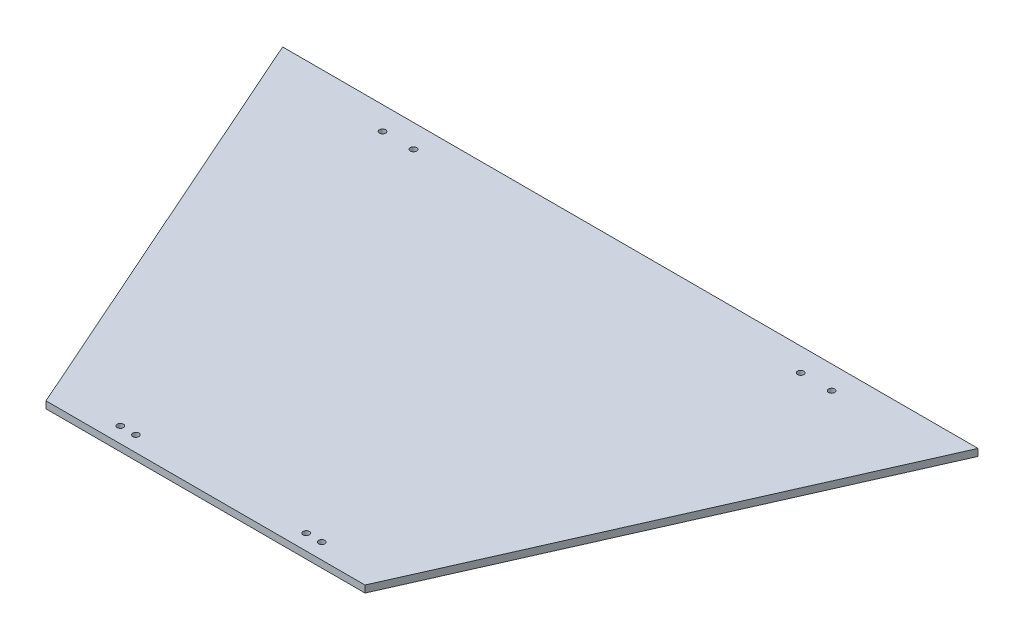
ISO-10303-21;
HEADER;
FILE_DESCRIPTION(('STEP AP214'),'2;1');
FILE_NAME('part.step','',(''),(''),'','','');
FILE_SCHEMA(('AUTOMOTIVE_DESIGN { 1 0 10303 214 1 1 1 1 }'));
ENDSEC;
DATA;
#1=APPLICATION_CONTEXT('core data for automotive mechanical design processes');
#2=APPLICATION_PROTOCOL_DEFINITION('international standard','automotive_design',2000,#1);
#3=PRODUCT_CONTEXT('',#1,'mechanical');
#4=PRODUCT('Part','Part','',(#3));
#5=PRODUCT_RELATED_PRODUCT_CATEGORY('part','',(#4));
#6=PRODUCT_DEFINITION_FORMATION('','',#4);
#7=PRODUCT_DEFINITION_CONTEXT('part definition',#1,'design');
#8=PRODUCT_DEFINITION('design','',#6,#7);
#9=PRODUCT_DEFINITION_SHAPE('','',#8);
#10=(LENGTH_UNIT() NAMED_UNIT(*) SI_UNIT(.MILLI.,.METRE.));
#11=(NAMED_UNIT(*) PLANE_ANGLE_UNIT() SI_UNIT($,.RADIAN.));
#12=(NAMED_UNIT(*) SI_UNIT($,.STERADIAN.) SOLID_ANGLE_UNIT());
#13=UNCERTAINTY_MEASURE_WITH_UNIT(LENGTH_MEASURE(1.E-05),#10,'distance_accuracy_value','');
#14=(GEOMETRIC_REPRESENTATION_CONTEXT(3) GLOBAL_UNCERTAINTY_ASSIGNED_CONTEXT((#13)) GLOBAL_UNIT_ASSIGNED_CONTEXT((#10,
#11,#12)) REPRESENTATION_CONTEXT('',''));
#15=CARTESIAN_POINT('',(0.,0.,0.));
#16=DIRECTION('',(0.,0.,1.));
#17=DIRECTION('',(1.,0.,0.));
#18=AXIS2_PLACEMENT_3D('',#15,#16,#17);
#19=CARTESIAN_POINT('',(-224.5,4.5,-274.3));
#20=DIRECTION('',(0.914319415465939,0.,-0.404993835140764));
#21=DIRECTION('',(-0.404993835140764,0.,-0.914319415465939));
#22=AXIS2_PLACEMENT_3D('',#19,#20,#21);
#23=PLANE('',#22);
#24=DIRECTION('',(0.404993835140764,0.,0.914319415465939));
#25=VECTOR('',#24,1.);
#26=CARTESIAN_POINT('',(-224.5,0.,-274.3));
#27=LINE('',#26,#25);
#28=CARTESIAN_POINT('',(-224.5,0.,-274.3));
#29=VERTEX_POINT('',#28);
#30=CARTESIAN_POINT('',(-103.,0.,0.));
#31=VERTEX_POINT('',#30);
#32=EDGE_CURVE('E101',#29,#31,#27,.T.);
#33=ORIENTED_EDGE('',*,*,#32,.T.);
#34=DIRECTION('',(0.,-1.,0.));
#35=VECTOR('',#34,1.);
#36=CARTESIAN_POINT('',(-103.,4.5,0.));
#37=LINE('',#36,#35);
#38=CARTESIAN_POINT('',(-103.,4.5,0.));
#39=VERTEX_POINT('',#38);
#40=EDGE_CURVE('E11',#39,#31,#37,.T.);
#41=ORIENTED_EDGE('',*,*,#40,.F.);
#42=DIRECTION('',(0.404993835140764,0.,0.914319415465939));
#43=VECTOR('',#42,1.);
#44=CARTESIAN_POINT('',(-224.5,4.5,-274.3));
#45=LINE('',#44,#43);
#46=CARTESIAN_POINT('',(-224.5,4.5,-274.3));
#47=VERTEX_POINT('',#46);
#48=EDGE_CURVE('E88',#47,#39,#45,.T.);
#49=ORIENTED_EDGE('',*,*,#48,.F.);
#50=DIRECTION('',(0.,-1.,0.));
#51=VECTOR('',#50,1.);
#52=CARTESIAN_POINT('',(-224.5,4.5,-274.3));
#53=LINE('',#52,#51);
#54=EDGE_CURVE('E97',#47,#29,#53,.T.);
#55=ORIENTED_EDGE('',*,*,#54,.T.);
#56=EDGE_LOOP('',(#33,#41,#49,#55));
#57=FACE_BOUND('',#56,.T.);
#58=ADVANCED_FACE('F35',(#57),#23,.F.);
#59=CARTESIAN_POINT('',(103.,4.5,0.));
#60=DIRECTION('',(0.,0.,-1.));
#61=DIRECTION('',(-1.,0.,0.));
#62=AXIS2_PLACEMENT_3D('',#59,#60,#61);
#63=PLANE('',#62);
#64=DIRECTION('',(1.,0.,0.));
#65=VECTOR('',#64,1.);
#66=CARTESIAN_POINT('',(103.,0.,0.));
#67=LINE('',#66,#65);
#68=CARTESIAN_POINT('',(103.,0.,0.));
#69=VERTEX_POINT('',#68);
#70=EDGE_CURVE('E92',#31,#69,#67,.T.);
#71=ORIENTED_EDGE('',*,*,#70,.T.);
#72=DIRECTION('',(0.,-1.,0.));
#73=VECTOR('',#72,1.);
#74=CARTESIAN_POINT('',(103.,4.5,0.));
#75=LINE('',#74,#73);
#76=CARTESIAN_POINT('',(103.,4.5,0.));
#77=VERTEX_POINT('',#76);
#78=EDGE_CURVE('E44',#77,#69,#75,.T.);
#79=ORIENTED_EDGE('',*,*,#78,.F.);
#80=DIRECTION('',(1.,0.,0.));
#81=VECTOR('',#80,1.);
#82=CARTESIAN_POINT('',(103.,4.5,0.));
#83=LINE('',#82,#81);
#84=EDGE_CURVE('E83',#39,#77,#83,.T.);
#85=ORIENTED_EDGE('',*,*,#84,.F.);
#86=ORIENTED_EDGE('',*,*,#40,.T.);
#87=EDGE_LOOP('',(#71,#79,#85,#86));
#88=FACE_BOUND('',#87,.T.);
#89=ADVANCED_FACE('F91',(#88),#63,.F.);
#90=CARTESIAN_POINT('',(224.5,4.5,-274.3));
#91=DIRECTION('',(-0.914319415465939,0.,-0.404993835140764));
#92=DIRECTION('',(-0.404993835140764,0.,0.914319415465939));
#93=AXIS2_PLACEMENT_3D('',#90,#91,#92);
#94=PLANE('',#93);
#95=DIRECTION('',(0.404993835140764,0.,-0.914319415465939));
#96=VECTOR('',#95,1.);
#97=CARTESIAN_POINT('',(224.5,0.,-274.3));
#98=LINE('',#97,#96);
#99=CARTESIAN_POINT('',(224.5,0.,-274.3));
#100=VERTEX_POINT('',#99);
#101=EDGE_CURVE('E70',#69,#100,#98,.T.);
#102=ORIENTED_EDGE('',*,*,#101,.T.);
#103=DIRECTION('',(0.,-1.,0.));
#104=VECTOR('',#103,1.);
#105=CARTESIAN_POINT('',(224.5,4.5,-274.3));
#106=LINE('',#105,#104);
#107=CARTESIAN_POINT('',(224.5,4.5,-274.3));
#108=VERTEX_POINT('',#107);
#109=EDGE_CURVE('E93',#108,#100,#106,.T.);
#110=ORIENTED_EDGE('',*,*,#109,.F.);
#111=DIRECTION('',(0.404993835140764,0.,-0.914319415465939));
#112=VECTOR('',#111,1.);
#113=CARTESIAN_POINT('',(224.5,4.5,-274.3));
#114=LINE('',#113,#112);
#115=EDGE_CURVE('E86',#77,#108,#114,.T.);
#116=ORIENTED_EDGE('',*,*,#115,.F.);
#117=ORIENTED_EDGE('',*,*,#78,.T.);
#118=EDGE_LOOP('',(#102,#110,#116,#117));
#119=FACE_BOUND('',#118,.T.);
#120=ADVANCED_FACE('F95',(#119),#94,.F.);
#121=CARTESIAN_POINT('',(-224.5,4.5,-274.3));
#122=DIRECTION('',(0.,0.,1.));
#123=DIRECTION('',(1.,0.,0.));
#124=AXIS2_PLACEMENT_3D('',#121,#122,#123);
#125=PLANE('',#124);
#126=DIRECTION('',(-1.,0.,0.));
#127=VECTOR('',#126,1.);
#128=CARTESIAN_POINT('',(-224.5,0.,-274.3));
#129=LINE('',#128,#127);
#130=EDGE_CURVE('E76',#100,#29,#129,.T.);
#131=ORIENTED_EDGE('',*,*,#130,.T.);
#132=ORIENTED_EDGE('',*,*,#54,.F.);
#133=DIRECTION('',(-1.,0.,0.));
#134=VECTOR('',#133,1.);
#135=CARTESIAN_POINT('',(-224.5,4.5,-274.3));
#136=LINE('',#135,#134);
#137=EDGE_CURVE('E53',#108,#47,#136,.T.);
#138=ORIENTED_EDGE('',*,*,#137,.F.);
#139=ORIENTED_EDGE('',*,*,#109,.T.);
#140=EDGE_LOOP('',(#131,#132,#138,#139));
#141=FACE_BOUND('',#140,.T.);
#142=ADVANCED_FACE('F157',(#141),#125,.F.);
#143=CARTESIAN_POINT('',(0.,4.5,0.));
#144=DIRECTION('',(0.,-1.,0.));
#145=DIRECTION('',(0.,0.,-1.));
#146=AXIS2_PLACEMENT_3D('',#143,#144,#145);
#147=PLANE('',#146);
#148=CARTESIAN_POINT('',(-145.,4.5,-259.3));
#149=DIRECTION('',(0.,1.,0.));
#150=DIRECTION('',(0.,0.,1.));
#151=AXIS2_PLACEMENT_3D('',#148,#149,#150);
#152=CIRCLE('',#151,2.);
#153=CARTESIAN_POINT('',(-145.,4.5,-257.3));
#154=VERTEX_POINT('',#153);
#155=EDGE_CURVE('E113',#154,#154,#152,.T.);
#156=ORIENTED_EDGE('',*,*,#155,.F.);
#157=EDGE_LOOP('',(#156));
#158=FACE_BOUND('',#157,.T.);
#159=CARTESIAN_POINT('',(65.,4.5,-10.));
#160=DIRECTION('',(0.,1.,0.));
#161=DIRECTION('',(0.,0.,-1.));
#162=AXIS2_PLACEMENT_3D('',#159,#160,#161);
#163=CIRCLE('',#162,2.);
#164=CARTESIAN_POINT('',(65.,4.5,-12.));
#165=VERTEX_POINT('',#164);
#166=EDGE_CURVE('E276',#165,#165,#163,.T.);
#167=ORIENTED_EDGE('',*,*,#166,.F.);
#168=EDGE_LOOP('',(#167));
#169=FACE_BOUND('',#168,.T.);
#170=CARTESIAN_POINT('',(55.,4.5,-10.));
#171=DIRECTION('',(0.,1.,0.));
#172=DIRECTION('',(0.,0.,-1.));
#173=AXIS2_PLACEMENT_3D('',#170,#171,#172);
#174=CIRCLE('',#173,2.);
#175=CARTESIAN_POINT('',(55.,4.5,-12.));
#176=VERTEX_POINT('',#175);
#177=EDGE_CURVE('E278',#176,#176,#174,.T.);
#178=ORIENTED_EDGE('',*,*,#177,.F.);
#179=EDGE_LOOP('',(#178));
#180=FACE_BOUND('',#179,.T.);
#181=CARTESIAN_POINT('',(-55.,4.5,-10.));
#182=DIRECTION('',(0.,1.,0.));
#183=DIRECTION('',(0.,0.,1.));
#184=AXIS2_PLACEMENT_3D('',#181,#182,#183);
#185=CIRCLE('',#184,2.);
#186=CARTESIAN_POINT('',(-55.,4.5,-8.00000000000002));
#187=VERTEX_POINT('',#186);
#188=EDGE_CURVE('E281',#187,#187,#185,.T.);
#189=ORIENTED_EDGE('',*,*,#188,.F.);
#190=EDGE_LOOP('',(#189));
#191=FACE_BOUND('',#190,.T.);
#192=CARTESIAN_POINT('',(-125.,4.5,-259.3));
#193=DIRECTION('',(0.,1.,0.));
#194=DIRECTION('',(0.,0.,1.));
#195=AXIS2_PLACEMENT_3D('',#192,#193,#194);
#196=CIRCLE('',#195,2.);
#197=CARTESIAN_POINT('',(-125.,4.5,-257.3));
#198=VERTEX_POINT('',#197);
#199=EDGE_CURVE('E292',#198,#198,#196,.T.);
#200=ORIENTED_EDGE('',*,*,#199,.F.);
#201=EDGE_LOOP('',(#200));
#202=FACE_BOUND('',#201,.T.);
#203=CARTESIAN_POINT('',(125.,4.5,-259.3));
#204=DIRECTION('',(0.,1.,0.));
#205=DIRECTION('',(0.,0.,-1.));
#206=AXIS2_PLACEMENT_3D('',#203,#204,#205);
#207=CIRCLE('',#206,2.);
#208=CARTESIAN_POINT('',(125.,4.5,-261.3));
#209=VERTEX_POINT('',#208);
#210=EDGE_CURVE('E288',#209,#209,#207,.T.);
#211=ORIENTED_EDGE('',*,*,#210,.F.);
#212=EDGE_LOOP('',(#211));
#213=FACE_BOUND('',#212,.T.);
#214=CARTESIAN_POINT('',(145.,4.5,-259.3));
#215=DIRECTION('',(0.,1.,0.));
#216=DIRECTION('',(0.,0.,-1.));
#217=AXIS2_PLACEMENT_3D('',#214,#215,#216);
#218=CIRCLE('',#217,2.);
#219=CARTESIAN_POINT('',(145.,4.5,-261.3));
#220=VERTEX_POINT('',#219);
#221=EDGE_CURVE('E285',#220,#220,#218,.T.);
#222=ORIENTED_EDGE('',*,*,#221,.F.);
#223=EDGE_LOOP('',(#222));
#224=FACE_BOUND('',#223,.T.);
#225=CARTESIAN_POINT('',(-65.,4.5,-10.));
#226=DIRECTION('',(0.,1.,0.));
#227=DIRECTION('',(0.,0.,1.));
#228=AXIS2_PLACEMENT_3D('',#225,#226,#227);
#229=CIRCLE('',#228,2.);
#230=CARTESIAN_POINT('',(-65.,4.5,-8.00000000000002));
#231=VERTEX_POINT('',#230);
#232=EDGE_CURVE('E289',#231,#231,#229,.T.);
#233=ORIENTED_EDGE('',*,*,#232,.F.);
#234=EDGE_LOOP('',(#233));
#235=FACE_BOUND('',#234,.T.);
#236=ORIENTED_EDGE('',*,*,#48,.T.);
#237=ORIENTED_EDGE('',*,*,#84,.T.);
#238=ORIENTED_EDGE('',*,*,#115,.T.);
#239=ORIENTED_EDGE('',*,*,#137,.T.);
#240=EDGE_LOOP('',(#236,#237,#238,#239));
#241=FACE_BOUND('',#240,.T.);
#242=ADVANCED_FACE('F84',(#158,#169,#180,#191,#202,#213,#224,#235,#241),#147,.F.);
#243=CARTESIAN_POINT('',(0.,0.,0.));
#244=DIRECTION('',(0.,-1.,0.));
#245=DIRECTION('',(0.,0.,-1.));
#246=AXIS2_PLACEMENT_3D('',#243,#244,#245);
#247=PLANE('',#246);
#248=CARTESIAN_POINT('',(-145.,0.,-259.3));
#249=DIRECTION('',(0.,-1.,0.));
#250=DIRECTION('',(0.,0.,-1.));
#251=AXIS2_PLACEMENT_3D('',#248,#249,#250);
#252=CIRCLE('',#251,2.);
#253=CARTESIAN_POINT('',(-145.,0.,-261.3));
#254=VERTEX_POINT('',#253);
#255=EDGE_CURVE('E38',#254,#254,#252,.T.);
#256=ORIENTED_EDGE('',*,*,#255,.F.);
#257=EDGE_LOOP('',(#256));
#258=FACE_BOUND('',#257,.T.);
#259=CARTESIAN_POINT('',(65.,0.,-10.));
#260=DIRECTION('',(0.,-1.,0.));
#261=DIRECTION('',(0.,0.,-1.));
#262=AXIS2_PLACEMENT_3D('',#259,#260,#261);
#263=CIRCLE('',#262,2.);
#264=CARTESIAN_POINT('',(65.,0.,-12.));
#265=VERTEX_POINT('',#264);
#266=EDGE_CURVE('E127',#265,#265,#263,.T.);
#267=ORIENTED_EDGE('',*,*,#266,.F.);
#268=EDGE_LOOP('',(#267));
#269=FACE_BOUND('',#268,.T.);
#270=CARTESIAN_POINT('',(55.,0.,-10.));
#271=DIRECTION('',(0.,-1.,0.));
#272=DIRECTION('',(0.,0.,-1.));
#273=AXIS2_PLACEMENT_3D('',#270,#271,#272);
#274=CIRCLE('',#273,2.);
#275=CARTESIAN_POINT('',(55.,0.,-12.));
#276=VERTEX_POINT('',#275);
#277=EDGE_CURVE('E125',#276,#276,#274,.T.);
#278=ORIENTED_EDGE('',*,*,#277,.F.);
#279=EDGE_LOOP('',(#278));
#280=FACE_BOUND('',#279,.T.);
#281=CARTESIAN_POINT('',(-55.,0.,-10.));
#282=DIRECTION('',(0.,-1.,0.));
#283=DIRECTION('',(0.,0.,-1.));
#284=AXIS2_PLACEMENT_3D('',#281,#282,#283);
#285=CIRCLE('',#284,2.);
#286=CARTESIAN_POINT('',(-55.,0.,-12.));
#287=VERTEX_POINT('',#286);
#288=EDGE_CURVE('E122',#287,#287,#285,.T.);
#289=ORIENTED_EDGE('',*,*,#288,.F.);
#290=EDGE_LOOP('',(#289));
#291=FACE_BOUND('',#290,.T.);
#292=CARTESIAN_POINT('',(-125.,0.,-259.3));
#293=DIRECTION('',(0.,-1.,0.));
#294=DIRECTION('',(0.,0.,-1.));
#295=AXIS2_PLACEMENT_3D('',#292,#293,#294);
#296=CIRCLE('',#295,2.);
#297=CARTESIAN_POINT('',(-125.,0.,-261.3));
#298=VERTEX_POINT('',#297);
#299=EDGE_CURVE('E119',#298,#298,#296,.T.);
#300=ORIENTED_EDGE('',*,*,#299,.F.);
#301=EDGE_LOOP('',(#300));
#302=FACE_BOUND('',#301,.T.);
#303=CARTESIAN_POINT('',(125.,0.,-259.3));
#304=DIRECTION('',(0.,-1.,0.));
#305=DIRECTION('',(0.,0.,-1.));
#306=AXIS2_PLACEMENT_3D('',#303,#304,#305);
#307=CIRCLE('',#306,2.);
#308=CARTESIAN_POINT('',(125.,0.,-261.3));
#309=VERTEX_POINT('',#308);
#310=EDGE_CURVE('E116',#309,#309,#307,.T.);
#311=ORIENTED_EDGE('',*,*,#310,.F.);
#312=EDGE_LOOP('',(#311));
#313=FACE_BOUND('',#312,.T.);
#314=CARTESIAN_POINT('',(145.,0.,-259.3));
#315=DIRECTION('',(0.,-1.,0.));
#316=DIRECTION('',(0.,0.,-1.));
#317=AXIS2_PLACEMENT_3D('',#314,#315,#316);
#318=CIRCLE('',#317,2.);
#319=CARTESIAN_POINT('',(145.,0.,-261.3));
#320=VERTEX_POINT('',#319);
#321=EDGE_CURVE('E112',#320,#320,#318,.T.);
#322=ORIENTED_EDGE('',*,*,#321,.F.);
#323=EDGE_LOOP('',(#322));
#324=FACE_BOUND('',#323,.T.);
#325=CARTESIAN_POINT('',(-65.,0.,-10.));
#326=DIRECTION('',(0.,-1.,0.));
#327=DIRECTION('',(0.,0.,-1.));
#328=AXIS2_PLACEMENT_3D('',#325,#326,#327);
#329=CIRCLE('',#328,2.);
#330=CARTESIAN_POINT('',(-65.,0.,-12.));
#331=VERTEX_POINT('',#330);
#332=EDGE_CURVE('E109',#331,#331,#329,.T.);
#333=ORIENTED_EDGE('',*,*,#332,.F.);
#334=EDGE_LOOP('',(#333));
#335=FACE_BOUND('',#334,.T.);
#336=ORIENTED_EDGE('',*,*,#32,.F.);
#337=ORIENTED_EDGE('',*,*,#130,.F.);
#338=ORIENTED_EDGE('',*,*,#101,.F.);
#339=ORIENTED_EDGE('',*,*,#70,.F.);
#340=EDGE_LOOP('',(#336,#337,#338,#339));
#341=FACE_BOUND('',#340,.T.);
#342=ADVANCED_FACE('F137',(#258,#269,#280,#291,#302,#313,#324,#335,#341),#247,.T.);
#343=CARTESIAN_POINT('',(-65.,-5.5,-10.));
#344=DIRECTION('',(0.,1.,0.));
#345=DIRECTION('',(0.,0.,1.));
#346=AXIS2_PLACEMENT_3D('',#343,#344,#345);
#347=CYLINDRICAL_SURFACE('',#346,2.);
#348=ORIENTED_EDGE('',*,*,#332,.T.);
#349=EDGE_LOOP('',(#348));
#350=FACE_BOUND('',#349,.T.);
#351=ORIENTED_EDGE('',*,*,#232,.T.);
#352=EDGE_LOOP('',(#351));
#353=FACE_BOUND('',#352,.T.);
#354=ADVANCED_FACE('F140',(#350,#353),#347,.F.);
#355=CARTESIAN_POINT('',(145.,-5.5,-259.3));
#356=DIRECTION('',(0.,1.,0.));
#357=DIRECTION('',(0.,0.,1.));
#358=AXIS2_PLACEMENT_3D('',#355,#356,#357);
#359=CYLINDRICAL_SURFACE('',#358,2.);
#360=ORIENTED_EDGE('',*,*,#321,.T.);
#361=EDGE_LOOP('',(#360));
#362=FACE_BOUND('',#361,.T.);
#363=ORIENTED_EDGE('',*,*,#221,.T.);
#364=EDGE_LOOP('',(#363));
#365=FACE_BOUND('',#364,.T.);
#366=ADVANCED_FACE('F202',(#362,#365),#359,.F.);
#367=CARTESIAN_POINT('',(125.,-5.5,-259.3));
#368=DIRECTION('',(0.,1.,0.));
#369=DIRECTION('',(0.,0.,1.));
#370=AXIS2_PLACEMENT_3D('',#367,#368,#369);
#371=CYLINDRICAL_SURFACE('',#370,2.);
#372=ORIENTED_EDGE('',*,*,#310,.T.);
#373=EDGE_LOOP('',(#372));
#374=FACE_BOUND('',#373,.T.);
#375=ORIENTED_EDGE('',*,*,#210,.T.);
#376=EDGE_LOOP('',(#375));
#377=FACE_BOUND('',#376,.T.);
#378=ADVANCED_FACE('F212',(#374,#377),#371,.F.);
#379=CARTESIAN_POINT('',(-125.,-5.5,-259.3));
#380=DIRECTION('',(0.,1.,0.));
#381=DIRECTION('',(0.,0.,1.));
#382=AXIS2_PLACEMENT_3D('',#379,#380,#381);
#383=CYLINDRICAL_SURFACE('',#382,2.);
#384=ORIENTED_EDGE('',*,*,#299,.T.);
#385=EDGE_LOOP('',(#384));
#386=FACE_BOUND('',#385,.T.);
#387=ORIENTED_EDGE('',*,*,#199,.T.);
#388=EDGE_LOOP('',(#387));
#389=FACE_BOUND('',#388,.T.);
#390=ADVANCED_FACE('F222',(#386,#389),#383,.F.);
#391=CARTESIAN_POINT('',(-55.,-5.5,-10.));
#392=DIRECTION('',(0.,1.,0.));
#393=DIRECTION('',(0.,0.,1.));
#394=AXIS2_PLACEMENT_3D('',#391,#392,#393);
#395=CYLINDRICAL_SURFACE('',#394,2.);
#396=ORIENTED_EDGE('',*,*,#288,.T.);
#397=EDGE_LOOP('',(#396));
#398=FACE_BOUND('',#397,.T.);
#399=ORIENTED_EDGE('',*,*,#188,.T.);
#400=EDGE_LOOP('',(#399));
#401=FACE_BOUND('',#400,.T.);
#402=ADVANCED_FACE('F232',(#398,#401),#395,.F.);
#403=CARTESIAN_POINT('',(55.,-5.5,-10.));
#404=DIRECTION('',(0.,1.,0.));
#405=DIRECTION('',(0.,0.,1.));
#406=AXIS2_PLACEMENT_3D('',#403,#404,#405);
#407=CYLINDRICAL_SURFACE('',#406,2.);
#408=ORIENTED_EDGE('',*,*,#277,.T.);
#409=EDGE_LOOP('',(#408));
#410=FACE_BOUND('',#409,.T.);
#411=ORIENTED_EDGE('',*,*,#177,.T.);
#412=EDGE_LOOP('',(#411));
#413=FACE_BOUND('',#412,.T.);
#414=ADVANCED_FACE('F242',(#410,#413),#407,.F.);
#415=CARTESIAN_POINT('',(65.,-5.5,-10.));
#416=DIRECTION('',(0.,1.,0.));
#417=DIRECTION('',(0.,0.,1.));
#418=AXIS2_PLACEMENT_3D('',#415,#416,#417);
#419=CYLINDRICAL_SURFACE('',#418,2.);
#420=ORIENTED_EDGE('',*,*,#266,.T.);
#421=EDGE_LOOP('',(#420));
#422=FACE_BOUND('',#421,.T.);
#423=ORIENTED_EDGE('',*,*,#166,.T.);
#424=EDGE_LOOP('',(#423));
#425=FACE_BOUND('',#424,.T.);
#426=ADVANCED_FACE('F252',(#422,#425),#419,.F.);
#427=CARTESIAN_POINT('',(-145.,-5.5,-259.3));
#428=DIRECTION('',(0.,1.,0.));
#429=DIRECTION('',(0.,0.,1.));
#430=AXIS2_PLACEMENT_3D('',#427,#428,#429);
#431=CYLINDRICAL_SURFACE('',#430,2.);
#432=ORIENTED_EDGE('',*,*,#255,.T.);
#433=EDGE_LOOP('',(#432));
#434=FACE_BOUND('',#433,.T.);
#435=ORIENTED_EDGE('',*,*,#155,.T.);
#436=EDGE_LOOP('',(#435));
#437=FACE_BOUND('',#436,.T.);
#438=ADVANCED_FACE('F134',(#434,#437),#431,.F.);
#439=CLOSED_SHELL('',(#58,#89,#120,#142,#242,#342,#354,#366,#378,#390,#402,#414,#426,#438));
#440=MANIFOLD_SOLID_BREP('B2',#439);
#441=ADVANCED_BREP_SHAPE_REPRESENTATION('',(#18,#440),#14);
#442=SHAPE_DEFINITION_REPRESENTATION(#9,#441);
ENDSEC;
END-ISO-10303-21;
